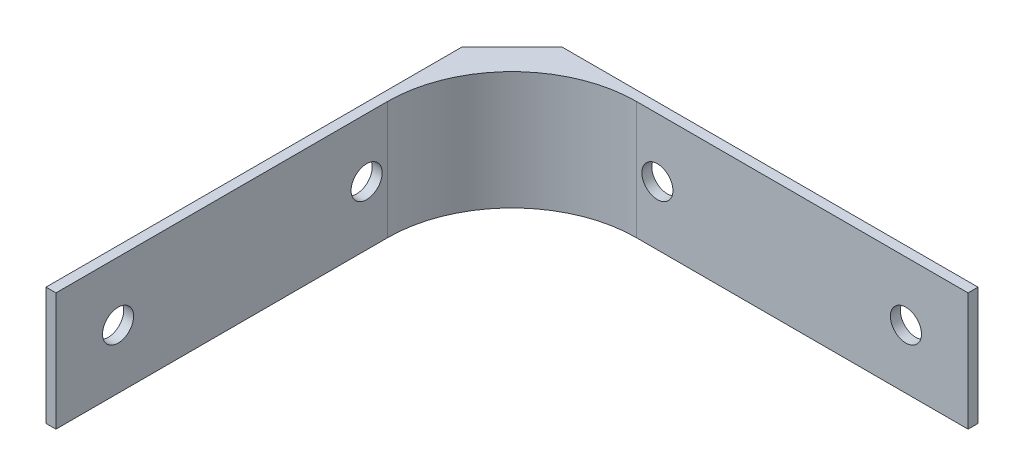
ISO-10303-21;
HEADER;
FILE_DESCRIPTION(('STEP AP214'),'2;1');
FILE_NAME('part.step','',(''),(''),'','','');
FILE_SCHEMA(('AUTOMOTIVE_DESIGN { 1 0 10303 214 1 1 1 1 }'));
ENDSEC;
DATA;
#1=APPLICATION_CONTEXT('core data for automotive mechanical design processes');
#2=APPLICATION_PROTOCOL_DEFINITION('international standard','automotive_design',2000,#1);
#3=PRODUCT_CONTEXT('',#1,'mechanical');
#4=PRODUCT('Part','Part','',(#3));
#5=PRODUCT_RELATED_PRODUCT_CATEGORY('part','',(#4));
#6=PRODUCT_DEFINITION_FORMATION('','',#4);
#7=PRODUCT_DEFINITION_CONTEXT('part definition',#1,'design');
#8=PRODUCT_DEFINITION('design','',#6,#7);
#9=PRODUCT_DEFINITION_SHAPE('','',#8);
#10=(LENGTH_UNIT() NAMED_UNIT(*) SI_UNIT(.MILLI.,.METRE.));
#11=(NAMED_UNIT(*) PLANE_ANGLE_UNIT() SI_UNIT($,.RADIAN.));
#12=(NAMED_UNIT(*) SI_UNIT($,.STERADIAN.) SOLID_ANGLE_UNIT());
#13=UNCERTAINTY_MEASURE_WITH_UNIT(LENGTH_MEASURE(1.E-05),#10,'distance_accuracy_value','');
#14=(GEOMETRIC_REPRESENTATION_CONTEXT(3) GLOBAL_UNCERTAINTY_ASSIGNED_CONTEXT((#13)) GLOBAL_UNIT_ASSIGNED_CONTEXT((#10,
#11,#12)) REPRESENTATION_CONTEXT('',''));
#15=CARTESIAN_POINT('',(0.,0.,0.));
#16=DIRECTION('',(0.,0.,1.));
#17=DIRECTION('',(1.,0.,0.));
#18=AXIS2_PLACEMENT_3D('',#15,#16,#17);
#19=CARTESIAN_POINT('',(21.6,19.,21.6));
#20=DIRECTION('',(0.,-1.,0.));
#21=DIRECTION('',(0.,0.,-1.));
#22=AXIS2_PLACEMENT_3D('',#19,#20,#21);
#23=CYLINDRICAL_SURFACE('',#22,20.);
#24=CARTESIAN_POINT('',(21.6,0.,21.6));
#25=DIRECTION('',(0.,1.,0.));
#26=DIRECTION('',(0.,0.,1.));
#27=AXIS2_PLACEMENT_3D('',#24,#25,#26);
#28=CIRCLE('',#27,20.);
#29=CARTESIAN_POINT('',(21.6,0.,1.6));
#30=VERTEX_POINT('',#29);
#31=CARTESIAN_POINT('',(1.6,0.,21.6));
#32=VERTEX_POINT('',#31);
#33=EDGE_CURVE('E134',#30,#32,#28,.T.);
#34=ORIENTED_EDGE('',*,*,#33,.F.);
#35=DIRECTION('',(0.,-1.,0.));
#36=VECTOR('',#35,1.);
#37=CARTESIAN_POINT('',(21.6,19.,1.6));
#38=LINE('',#37,#36);
#39=CARTESIAN_POINT('',(21.6,19.,1.6));
#40=VERTEX_POINT('',#39);
#41=EDGE_CURVE('E11',#40,#30,#38,.T.);
#42=ORIENTED_EDGE('',*,*,#41,.F.);
#43=CARTESIAN_POINT('',(21.6,19.,21.6));
#44=DIRECTION('',(0.,1.,0.));
#45=DIRECTION('',(0.,0.,1.));
#46=AXIS2_PLACEMENT_3D('',#43,#44,#45);
#47=CIRCLE('',#46,20.);
#48=CARTESIAN_POINT('',(1.6,19.,21.6));
#49=VERTEX_POINT('',#48);
#50=EDGE_CURVE('E154',#40,#49,#47,.T.);
#51=ORIENTED_EDGE('',*,*,#50,.T.);
#52=DIRECTION('',(0.,-1.,0.));
#53=VECTOR('',#52,1.);
#54=CARTESIAN_POINT('',(1.6,19.,21.6));
#55=LINE('',#54,#53);
#56=EDGE_CURVE('E55',#49,#32,#55,.T.);
#57=ORIENTED_EDGE('',*,*,#56,.T.);
#58=EDGE_LOOP('',(#34,#42,#51,#57));
#59=FACE_BOUND('',#58,.T.);
#60=ADVANCED_FACE('F39',(#59),#23,.F.);
#61=CARTESIAN_POINT('',(0.,19.,1.6));
#62=DIRECTION('',(0.,0.,-1.));
#63=DIRECTION('',(-1.,0.,0.));
#64=AXIS2_PLACEMENT_3D('',#61,#62,#63);
#65=PLANE('',#64);
#66=CARTESIAN_POINT('',(25.,9.5,1.6));
#67=DIRECTION('',(0.,0.,1.));
#68=DIRECTION('',(1.,0.,0.));
#69=AXIS2_PLACEMENT_3D('',#66,#67,#68);
#70=CIRCLE('',#69,2.5);
#71=CARTESIAN_POINT('',(27.5,9.5,1.6));
#72=VERTEX_POINT('',#71);
#73=EDGE_CURVE('E192',#72,#72,#70,.T.);
#74=ORIENTED_EDGE('',*,*,#73,.F.);
#75=EDGE_LOOP('',(#74));
#76=FACE_BOUND('',#75,.T.);
#77=CARTESIAN_POINT('',(65.,9.5,1.6));
#78=DIRECTION('',(0.,0.,1.));
#79=DIRECTION('',(1.,0.,0.));
#80=AXIS2_PLACEMENT_3D('',#77,#78,#79);
#81=CIRCLE('',#80,2.5);
#82=CARTESIAN_POINT('',(67.5,9.5,1.6));
#83=VERTEX_POINT('',#82);
#84=EDGE_CURVE('E185',#83,#83,#81,.T.);
#85=ORIENTED_EDGE('',*,*,#84,.F.);
#86=EDGE_LOOP('',(#85));
#87=FACE_BOUND('',#86,.T.);
#88=DIRECTION('',(1.,0.,0.));
#89=VECTOR('',#88,1.);
#90=CARTESIAN_POINT('',(0.,0.,1.6));
#91=LINE('',#90,#89);
#92=CARTESIAN_POINT('',(75.,0.,1.6));
#93=VERTEX_POINT('',#92);
#94=EDGE_CURVE('E136',#30,#93,#91,.T.);
#95=ORIENTED_EDGE('',*,*,#94,.T.);
#96=DIRECTION('',(0.,-1.,0.));
#97=VECTOR('',#96,1.);
#98=CARTESIAN_POINT('',(75.,19.,1.6));
#99=LINE('',#98,#97);
#100=CARTESIAN_POINT('',(75.,19.,1.6));
#101=VERTEX_POINT('',#100);
#102=EDGE_CURVE('E47',#101,#93,#99,.T.);
#103=ORIENTED_EDGE('',*,*,#102,.F.);
#104=DIRECTION('',(1.,0.,0.));
#105=VECTOR('',#104,1.);
#106=CARTESIAN_POINT('',(0.,19.,1.6));
#107=LINE('',#106,#105);
#108=EDGE_CURVE('E179',#40,#101,#107,.T.);
#109=ORIENTED_EDGE('',*,*,#108,.F.);
#110=ORIENTED_EDGE('',*,*,#41,.T.);
#111=EDGE_LOOP('',(#95,#103,#109,#110));
#112=FACE_BOUND('',#111,.T.);
#113=ADVANCED_FACE('F170',(#76,#87,#112),#65,.F.);
#114=CARTESIAN_POINT('',(75.,19.,0.));
#115=DIRECTION('',(1.,0.,0.));
#116=DIRECTION('',(0.,0.,-1.));
#117=AXIS2_PLACEMENT_3D('',#114,#115,#116);
#118=PLANE('',#117);
#119=DIRECTION('',(0.,0.,1.));
#120=VECTOR('',#119,1.);
#121=CARTESIAN_POINT('',(75.,0.,0.));
#122=LINE('',#121,#120);
#123=CARTESIAN_POINT('',(75.,0.,0.));
#124=VERTEX_POINT('',#123);
#125=EDGE_CURVE('E140',#124,#93,#122,.T.);
#126=ORIENTED_EDGE('',*,*,#125,.F.);
#127=DIRECTION('',(0.,-1.,0.));
#128=VECTOR('',#127,1.);
#129=CARTESIAN_POINT('',(75.,19.,0.));
#130=LINE('',#129,#128);
#131=CARTESIAN_POINT('',(75.,19.,0.));
#132=VERTEX_POINT('',#131);
#133=EDGE_CURVE('E160',#132,#124,#130,.T.);
#134=ORIENTED_EDGE('',*,*,#133,.F.);
#135=DIRECTION('',(0.,0.,1.));
#136=VECTOR('',#135,1.);
#137=CARTESIAN_POINT('',(75.,19.,0.));
#138=LINE('',#137,#136);
#139=EDGE_CURVE('E167',#132,#101,#138,.T.);
#140=ORIENTED_EDGE('',*,*,#139,.T.);
#141=ORIENTED_EDGE('',*,*,#102,.T.);
#142=EDGE_LOOP('',(#126,#134,#140,#141));
#143=FACE_BOUND('',#142,.T.);
#144=ADVANCED_FACE('F165',(#143),#118,.T.);
#145=CARTESIAN_POINT('',(0.,19.,0.));
#146=DIRECTION('',(0.,0.,-1.));
#147=DIRECTION('',(-1.,0.,0.));
#148=AXIS2_PLACEMENT_3D('',#145,#146,#147);
#149=PLANE('',#148);
#150=CARTESIAN_POINT('',(25.,9.5,0.));
#151=DIRECTION('',(0.,0.,1.));
#152=DIRECTION('',(1.,0.,0.));
#153=AXIS2_PLACEMENT_3D('',#150,#151,#152);
#154=CIRCLE('',#153,2.5);
#155=CARTESIAN_POINT('',(27.5,9.5,0.));
#156=VERTEX_POINT('',#155);
#157=EDGE_CURVE('E137',#156,#156,#154,.T.);
#158=ORIENTED_EDGE('',*,*,#157,.T.);
#159=EDGE_LOOP('',(#158));
#160=FACE_BOUND('',#159,.T.);
#161=CARTESIAN_POINT('',(65.,9.5,0.));
#162=DIRECTION('',(0.,0.,1.));
#163=DIRECTION('',(1.,0.,0.));
#164=AXIS2_PLACEMENT_3D('',#161,#162,#163);
#165=CIRCLE('',#164,2.5);
#166=CARTESIAN_POINT('',(67.5,9.5,0.));
#167=VERTEX_POINT('',#166);
#168=EDGE_CURVE('E188',#167,#167,#165,.T.);
#169=ORIENTED_EDGE('',*,*,#168,.T.);
#170=EDGE_LOOP('',(#169));
#171=FACE_BOUND('',#170,.T.);
#172=DIRECTION('',(1.,0.,0.));
#173=VECTOR('',#172,1.);
#174=CARTESIAN_POINT('',(0.,0.,0.));
#175=LINE('',#174,#173);
#176=CARTESIAN_POINT('',(7.99999999999999,0.,0.));
#177=VERTEX_POINT('',#176);
#178=EDGE_CURVE('E143',#177,#124,#175,.T.);
#179=ORIENTED_EDGE('',*,*,#178,.F.);
#180=DIRECTION('',(0.,-1.,0.));
#181=VECTOR('',#180,1.);
#182=CARTESIAN_POINT('',(7.99999999999999,19.,0.));
#183=LINE('',#182,#181);
#184=CARTESIAN_POINT('',(7.99999999999999,19.,0.));
#185=VERTEX_POINT('',#184);
#186=EDGE_CURVE('E158',#185,#177,#183,.T.);
#187=ORIENTED_EDGE('',*,*,#186,.F.);
#188=DIRECTION('',(1.,0.,0.));
#189=VECTOR('',#188,1.);
#190=CARTESIAN_POINT('',(0.,19.,0.));
#191=LINE('',#190,#189);
#192=EDGE_CURVE('E178',#185,#132,#191,.T.);
#193=ORIENTED_EDGE('',*,*,#192,.T.);
#194=ORIENTED_EDGE('',*,*,#133,.T.);
#195=EDGE_LOOP('',(#179,#187,#193,#194));
#196=FACE_BOUND('',#195,.T.);
#197=ADVANCED_FACE('F176',(#160,#171,#196),#149,.T.);
#198=CARTESIAN_POINT('',(4.,19.,4.));
#199=DIRECTION('',(0.707106781186548,0.,0.707106781186548));
#200=DIRECTION('',(0.707106781186548,0.,-0.707106781186548));
#201=AXIS2_PLACEMENT_3D('',#198,#199,#200);
#202=PLANE('',#201);
#203=DIRECTION('',(-0.707106781186547,0.,0.707106781186548));
#204=VECTOR('',#203,1.);
#205=CARTESIAN_POINT('',(4.,0.,4.));
#206=LINE('',#205,#204);
#207=CARTESIAN_POINT('',(0.,0.,7.99999999999999));
#208=VERTEX_POINT('',#207);
#209=EDGE_CURVE('E146',#177,#208,#206,.T.);
#210=ORIENTED_EDGE('',*,*,#209,.T.);
#211=DIRECTION('',(0.,-1.,0.));
#212=VECTOR('',#211,1.);
#213=CARTESIAN_POINT('',(0.,19.,7.99999999999999));
#214=LINE('',#213,#212);
#215=CARTESIAN_POINT('',(0.,19.,7.99999999999999));
#216=VERTEX_POINT('',#215);
#217=EDGE_CURVE('E126',#216,#208,#214,.T.);
#218=ORIENTED_EDGE('',*,*,#217,.F.);
#219=DIRECTION('',(-0.707106781186547,0.,0.707106781186548));
#220=VECTOR('',#219,1.);
#221=CARTESIAN_POINT('',(4.,19.,4.));
#222=LINE('',#221,#220);
#223=EDGE_CURVE('E114',#185,#216,#222,.T.);
#224=ORIENTED_EDGE('',*,*,#223,.F.);
#225=ORIENTED_EDGE('',*,*,#186,.T.);
#226=EDGE_LOOP('',(#210,#218,#224,#225));
#227=FACE_BOUND('',#226,.T.);
#228=ADVANCED_FACE('F237',(#227),#202,.F.);
#229=CARTESIAN_POINT('',(0.,19.,0.));
#230=DIRECTION('',(1.,0.,0.));
#231=DIRECTION('',(0.,0.,-1.));
#232=AXIS2_PLACEMENT_3D('',#229,#230,#231);
#233=PLANE('',#232);
#234=CARTESIAN_POINT('',(0.,9.5,65.));
#235=DIRECTION('',(1.,0.,0.));
#236=DIRECTION('',(0.,0.,-1.));
#237=AXIS2_PLACEMENT_3D('',#234,#235,#236);
#238=CIRCLE('',#237,2.49999999999999);
#239=CARTESIAN_POINT('',(0.,9.5,62.5));
#240=VERTEX_POINT('',#239);
#241=EDGE_CURVE('E189',#240,#240,#238,.T.);
#242=ORIENTED_EDGE('',*,*,#241,.T.);
#243=EDGE_LOOP('',(#242));
#244=FACE_BOUND('',#243,.T.);
#245=CARTESIAN_POINT('',(0.,9.5,25.));
#246=DIRECTION('',(1.,0.,0.));
#247=DIRECTION('',(0.,0.,-1.));
#248=AXIS2_PLACEMENT_3D('',#245,#246,#247);
#249=CIRCLE('',#248,2.5);
#250=CARTESIAN_POINT('',(0.,9.5,22.5));
#251=VERTEX_POINT('',#250);
#252=EDGE_CURVE('E200',#251,#251,#249,.T.);
#253=ORIENTED_EDGE('',*,*,#252,.T.);
#254=EDGE_LOOP('',(#253));
#255=FACE_BOUND('',#254,.T.);
#256=DIRECTION('',(0.,0.,1.));
#257=VECTOR('',#256,1.);
#258=CARTESIAN_POINT('',(0.,0.,0.));
#259=LINE('',#258,#257);
#260=CARTESIAN_POINT('',(0.,0.,75.));
#261=VERTEX_POINT('',#260);
#262=EDGE_CURVE('E123',#208,#261,#259,.T.);
#263=ORIENTED_EDGE('',*,*,#262,.T.);
#264=DIRECTION('',(0.,-1.,0.));
#265=VECTOR('',#264,1.);
#266=CARTESIAN_POINT('',(0.,19.,75.));
#267=LINE('',#266,#265);
#268=CARTESIAN_POINT('',(0.,19.,75.));
#269=VERTEX_POINT('',#268);
#270=EDGE_CURVE('E120',#269,#261,#267,.T.);
#271=ORIENTED_EDGE('',*,*,#270,.F.);
#272=DIRECTION('',(0.,0.,1.));
#273=VECTOR('',#272,1.);
#274=CARTESIAN_POINT('',(0.,19.,0.));
#275=LINE('',#274,#273);
#276=EDGE_CURVE('E105',#216,#269,#275,.T.);
#277=ORIENTED_EDGE('',*,*,#276,.F.);
#278=ORIENTED_EDGE('',*,*,#217,.T.);
#279=EDGE_LOOP('',(#263,#271,#277,#278));
#280=FACE_BOUND('',#279,.T.);
#281=ADVANCED_FACE('F121',(#244,#255,#280),#233,.F.);
#282=CARTESIAN_POINT('',(-6.50521303491303E-13,19.,75.));
#283=DIRECTION('',(0.,0.,-1.));
#284=DIRECTION('',(-1.,0.,0.));
#285=AXIS2_PLACEMENT_3D('',#282,#283,#284);
#286=PLANE('',#285);
#287=DIRECTION('',(1.,0.,0.));
#288=VECTOR('',#287,1.);
#289=CARTESIAN_POINT('',(-6.50521303491303E-13,0.,75.));
#290=LINE('',#289,#288);
#291=CARTESIAN_POINT('',(1.60000000000001,0.,75.));
#292=VERTEX_POINT('',#291);
#293=EDGE_CURVE('E149',#261,#292,#290,.T.);
#294=ORIENTED_EDGE('',*,*,#293,.T.);
#295=DIRECTION('',(0.,-1.,0.));
#296=VECTOR('',#295,1.);
#297=CARTESIAN_POINT('',(1.60000000000001,19.,75.));
#298=LINE('',#297,#296);
#299=CARTESIAN_POINT('',(1.60000000000001,19.,75.));
#300=VERTEX_POINT('',#299);
#301=EDGE_CURVE('E81',#300,#292,#298,.T.);
#302=ORIENTED_EDGE('',*,*,#301,.F.);
#303=DIRECTION('',(1.,0.,0.));
#304=VECTOR('',#303,1.);
#305=CARTESIAN_POINT('',(-6.50521303491303E-13,19.,75.));
#306=LINE('',#305,#304);
#307=EDGE_CURVE('E111',#269,#300,#306,.T.);
#308=ORIENTED_EDGE('',*,*,#307,.F.);
#309=ORIENTED_EDGE('',*,*,#270,.T.);
#310=EDGE_LOOP('',(#294,#302,#308,#309));
#311=FACE_BOUND('',#310,.T.);
#312=ADVANCED_FACE('F128',(#311),#286,.F.);
#313=CARTESIAN_POINT('',(1.6,19.,0.));
#314=DIRECTION('',(1.,0.,0.));
#315=DIRECTION('',(0.,0.,-1.));
#316=AXIS2_PLACEMENT_3D('',#313,#314,#315);
#317=PLANE('',#316);
#318=CARTESIAN_POINT('',(1.60000000000001,9.5,65.));
#319=DIRECTION('',(1.,0.,0.));
#320=DIRECTION('',(0.,0.,-1.));
#321=AXIS2_PLACEMENT_3D('',#318,#319,#320);
#322=CIRCLE('',#321,2.49999999999999);
#323=CARTESIAN_POINT('',(1.60000000000001,9.5,62.5));
#324=VERTEX_POINT('',#323);
#325=EDGE_CURVE('E203',#324,#324,#322,.T.);
#326=ORIENTED_EDGE('',*,*,#325,.F.);
#327=EDGE_LOOP('',(#326));
#328=FACE_BOUND('',#327,.T.);
#329=CARTESIAN_POINT('',(1.6,9.5,25.));
#330=DIRECTION('',(1.,0.,0.));
#331=DIRECTION('',(0.,0.,-1.));
#332=AXIS2_PLACEMENT_3D('',#329,#330,#331);
#333=CIRCLE('',#332,2.5);
#334=CARTESIAN_POINT('',(1.6,9.5,22.5));
#335=VERTEX_POINT('',#334);
#336=EDGE_CURVE('E197',#335,#335,#333,.T.);
#337=ORIENTED_EDGE('',*,*,#336,.F.);
#338=EDGE_LOOP('',(#337));
#339=FACE_BOUND('',#338,.T.);
#340=DIRECTION('',(0.,0.,1.));
#341=VECTOR('',#340,1.);
#342=CARTESIAN_POINT('',(1.6,0.,0.));
#343=LINE('',#342,#341);
#344=EDGE_CURVE('E151',#32,#292,#343,.T.);
#345=ORIENTED_EDGE('',*,*,#344,.F.);
#346=ORIENTED_EDGE('',*,*,#56,.F.);
#347=DIRECTION('',(0.,0.,1.));
#348=VECTOR('',#347,1.);
#349=CARTESIAN_POINT('',(1.6,19.,0.));
#350=LINE('',#349,#348);
#351=EDGE_CURVE('E129',#49,#300,#350,.T.);
#352=ORIENTED_EDGE('',*,*,#351,.T.);
#353=ORIENTED_EDGE('',*,*,#301,.T.);
#354=EDGE_LOOP('',(#345,#346,#352,#353));
#355=FACE_BOUND('',#354,.T.);
#356=ADVANCED_FACE('F218',(#328,#339,#355),#317,.T.);
#357=CARTESIAN_POINT('',(0.,19.,0.));
#358=DIRECTION('',(0.,1.,0.));
#359=DIRECTION('',(0.,0.,1.));
#360=AXIS2_PLACEMENT_3D('',#357,#358,#359);
#361=PLANE('',#360);
#362=ORIENTED_EDGE('',*,*,#50,.F.);
#363=ORIENTED_EDGE('',*,*,#108,.T.);
#364=ORIENTED_EDGE('',*,*,#139,.F.);
#365=ORIENTED_EDGE('',*,*,#192,.F.);
#366=ORIENTED_EDGE('',*,*,#223,.T.);
#367=ORIENTED_EDGE('',*,*,#276,.T.);
#368=ORIENTED_EDGE('',*,*,#307,.T.);
#369=ORIENTED_EDGE('',*,*,#351,.F.);
#370=EDGE_LOOP('',(#362,#363,#364,#365,#366,#367,#368,#369));
#371=FACE_BOUND('',#370,.T.);
#372=ADVANCED_FACE('F108',(#371),#361,.T.);
#373=CARTESIAN_POINT('',(0.,0.,0.));
#374=DIRECTION('',(0.,1.,0.));
#375=DIRECTION('',(0.,0.,1.));
#376=AXIS2_PLACEMENT_3D('',#373,#374,#375);
#377=PLANE('',#376);
#378=ORIENTED_EDGE('',*,*,#33,.T.);
#379=ORIENTED_EDGE('',*,*,#344,.T.);
#380=ORIENTED_EDGE('',*,*,#293,.F.);
#381=ORIENTED_EDGE('',*,*,#262,.F.);
#382=ORIENTED_EDGE('',*,*,#209,.F.);
#383=ORIENTED_EDGE('',*,*,#178,.T.);
#384=ORIENTED_EDGE('',*,*,#125,.T.);
#385=ORIENTED_EDGE('',*,*,#94,.F.);
#386=EDGE_LOOP('',(#378,#379,#380,#381,#382,#383,#384,#385));
#387=FACE_BOUND('',#386,.T.);
#388=ADVANCED_FACE('F172',(#387),#377,.F.);
#389=CARTESIAN_POINT('',(65.,9.5,0.));
#390=DIRECTION('',(0.,0.,1.));
#391=DIRECTION('',(1.,0.,0.));
#392=AXIS2_PLACEMENT_3D('',#389,#390,#391);
#393=CYLINDRICAL_SURFACE('',#392,2.5);
#394=ORIENTED_EDGE('',*,*,#168,.F.);
#395=EDGE_LOOP('',(#394));
#396=FACE_BOUND('',#395,.T.);
#397=ORIENTED_EDGE('',*,*,#84,.T.);
#398=EDGE_LOOP('',(#397));
#399=FACE_BOUND('',#398,.T.);
#400=ADVANCED_FACE('F248',(#396,#399),#393,.F.);
#401=CARTESIAN_POINT('',(25.,9.5,0.));
#402=DIRECTION('',(0.,0.,1.));
#403=DIRECTION('',(1.,0.,0.));
#404=AXIS2_PLACEMENT_3D('',#401,#402,#403);
#405=CYLINDRICAL_SURFACE('',#404,2.5);
#406=ORIENTED_EDGE('',*,*,#157,.F.);
#407=EDGE_LOOP('',(#406));
#408=FACE_BOUND('',#407,.T.);
#409=ORIENTED_EDGE('',*,*,#73,.T.);
#410=EDGE_LOOP('',(#409));
#411=FACE_BOUND('',#410,.T.);
#412=ADVANCED_FACE('F253',(#408,#411),#405,.F.);
#413=CARTESIAN_POINT('',(0.,9.5,25.));
#414=DIRECTION('',(1.,0.,0.));
#415=DIRECTION('',(0.,0.,-1.));
#416=AXIS2_PLACEMENT_3D('',#413,#414,#415);
#417=CYLINDRICAL_SURFACE('',#416,2.5);
#418=CARTESIAN_POINT('',(0.,9.5,22.5));
#419=CARTESIAN_POINT('',(0.0166666666666619,9.5,22.5));
#420=CARTESIAN_POINT('',(0.0333333333333286,9.5,22.5));
#421=CARTESIAN_POINT('',(0.0666666666666621,9.5,22.5));
#422=CARTESIAN_POINT('',(0.0833333333333289,9.5,22.5));
#423=CARTESIAN_POINT('',(0.116666666666662,9.5,22.5));
#424=CARTESIAN_POINT('',(0.133333333333329,9.5,22.5));
#425=CARTESIAN_POINT('',(0.166666666666663,9.5,22.5));
#426=CARTESIAN_POINT('',(0.183333333333329,9.5,22.5));
#427=CARTESIAN_POINT('',(0.216666666666663,9.5,22.5));
#428=CARTESIAN_POINT('',(0.23333333333333,9.5,22.5));
#429=CARTESIAN_POINT('',(0.266666666666663,9.5,22.5));
#430=CARTESIAN_POINT('',(0.28333333333333,9.5,22.5));
#431=CARTESIAN_POINT('',(0.316666666666663,9.5,22.5));
#432=CARTESIAN_POINT('',(0.33333333333333,9.5,22.5));
#433=CARTESIAN_POINT('',(0.366666666666663,9.5,22.5));
#434=CARTESIAN_POINT('',(0.38333333333333,9.5,22.5));
#435=CARTESIAN_POINT('',(0.416666666666664,9.5,22.5));
#436=CARTESIAN_POINT('',(0.433333333333331,9.5,22.5));
#437=CARTESIAN_POINT('',(0.466666666666664,9.5,22.5));
#438=CARTESIAN_POINT('',(0.483333333333331,9.5,22.5));
#439=CARTESIAN_POINT('',(0.516666666666664,9.5,22.5));
#440=CARTESIAN_POINT('',(0.533333333333331,9.5,22.5));
#441=CARTESIAN_POINT('',(0.566666666666664,9.5,22.5));
#442=CARTESIAN_POINT('',(0.583333333333331,9.5,22.5));
#443=CARTESIAN_POINT('',(0.616666666666665,9.5,22.5));
#444=CARTESIAN_POINT('',(0.633333333333331,9.5,22.5));
#445=CARTESIAN_POINT('',(0.666666666666665,9.5,22.5));
#446=CARTESIAN_POINT('',(0.683333333333332,9.5,22.5));
#447=CARTESIAN_POINT('',(0.716666666666665,9.5,22.5));
#448=CARTESIAN_POINT('',(0.733333333333332,9.5,22.5));
#449=CARTESIAN_POINT('',(0.766666666666665,9.5,22.5));
#450=CARTESIAN_POINT('',(0.783333333333332,9.5,22.5));
#451=CARTESIAN_POINT('',(0.816666666666666,9.5,22.5));
#452=CARTESIAN_POINT('',(0.833333333333332,9.5,22.5));
#453=CARTESIAN_POINT('',(0.866666666666666,9.5,22.5));
#454=CARTESIAN_POINT('',(0.883333333333333,9.5,22.5));
#455=CARTESIAN_POINT('',(0.916666666666666,9.5,22.5));
#456=CARTESIAN_POINT('',(0.933333333333333,9.5,22.5));
#457=CARTESIAN_POINT('',(0.966666666666666,9.5,22.5));
#458=CARTESIAN_POINT('',(0.983333333333333,9.5,22.5));
#459=CARTESIAN_POINT('',(1.01666666666667,9.5,22.5));
#460=CARTESIAN_POINT('',(1.03333333333333,9.5,22.5));
#461=CARTESIAN_POINT('',(1.06666666666667,9.5,22.5));
#462=CARTESIAN_POINT('',(1.08333333333333,9.5,22.5));
#463=CARTESIAN_POINT('',(1.11666666666667,9.5,22.5));
#464=CARTESIAN_POINT('',(1.13333333333333,9.5,22.5));
#465=CARTESIAN_POINT('',(1.16666666666667,9.5,22.5));
#466=CARTESIAN_POINT('',(1.18333333333333,9.5,22.5));
#467=CARTESIAN_POINT('',(1.21666666666667,9.5,22.5));
#468=CARTESIAN_POINT('',(1.23333333333333,9.5,22.5));
#469=CARTESIAN_POINT('',(1.26666666666667,9.5,22.5));
#470=CARTESIAN_POINT('',(1.28333333333333,9.5,22.5));
#471=CARTESIAN_POINT('',(1.31666666666667,9.5,22.5));
#472=CARTESIAN_POINT('',(1.33333333333333,9.5,22.5));
#473=CARTESIAN_POINT('',(1.36666666666667,9.5,22.5));
#474=CARTESIAN_POINT('',(1.38333333333333,9.5,22.5));
#475=CARTESIAN_POINT('',(1.41666666666667,9.5,22.5));
#476=CARTESIAN_POINT('',(1.43333333333334,9.5,22.5));
#477=CARTESIAN_POINT('',(1.46666666666667,9.5,22.5));
#478=CARTESIAN_POINT('',(1.48333333333334,9.5,22.5));
#479=CARTESIAN_POINT('',(1.51666666666667,9.5,22.5));
#480=CARTESIAN_POINT('',(1.53333333333334,9.5,22.5));
#481=CARTESIAN_POINT('',(1.56666666666667,9.5,22.5));
#482=CARTESIAN_POINT('',(1.58333333333334,9.5,22.5));
#483=CARTESIAN_POINT('',(1.6,9.5,22.5));
#484=B_SPLINE_CURVE_WITH_KNOTS('',3,(#418,#419,#420,#421,#422,#423,#424,#425,#426,#427,#428,
#429,#430,#431,#432,#433,#434,#435,#436,#437,#438,#439,#440,#441,#442,#443,#444,#445,#446,#447,
#448,#449,#450,#451,#452,#453,#454,#455,#456,#457,#458,#459,#460,#461,#462,#463,#464,#465,#466,
#467,#468,#469,#470,#471,#472,#473,#474,#475,#476,#477,#478,#479,#480,#481,#482,#483),
.UNSPECIFIED.,.F.,.F.,(4,2,2,2,2,2,2,2,2,2,2,2,2,2,2,2,2,2,2,2,2,2,2,2,2,2,2,2,2,2,2,2,4),(0.,
0.0500000000000002,0.1,0.150000000000001,0.200000000000001,0.250000000000001,0.300000000000001,
0.350000000000002,0.400000000000002,0.450000000000002,0.500000000000002,0.550000000000002,
0.600000000000003,0.650000000000003,0.700000000000003,0.750000000000003,0.800000000000004,
0.850000000000004,0.900000000000004,0.950000000000004,1.,1.05,1.1,1.15000000000001,
1.20000000000001,1.25000000000001,1.30000000000001,1.35000000000001,1.40000000000001,
1.45000000000001,1.50000000000001,1.55000000000001,1.60000000000001),.UNSPECIFIED.);
#485=EDGE_CURVE('BSEAM214',#251,#335,#484,.T.);
#486=ORIENTED_EDGE('',*,*,#252,.F.);
#487=ORIENTED_EDGE('',*,*,#336,.T.);
#488=ORIENTED_EDGE('',*,*,#485,.T.);
#489=ORIENTED_EDGE('',*,*,#485,.F.);
#490=EDGE_LOOP('',(#486,#488,#487,#489));
#491=FACE_BOUND('',#490,.T.);
#492=ADVANCED_FACE('F214',(#491),#417,.F.);
#493=CARTESIAN_POINT('',(0.,9.5,65.));
#494=DIRECTION('',(1.,0.,0.));
#495=DIRECTION('',(0.,0.,-1.));
#496=AXIS2_PLACEMENT_3D('',#493,#494,#495);
#497=CYLINDRICAL_SURFACE('',#496,2.49999999999999);
#498=CARTESIAN_POINT('',(0.,9.5,62.5));
#499=CARTESIAN_POINT('',(0.0166666666666669,9.5,62.5));
#500=CARTESIAN_POINT('',(0.0333333333333336,9.5,62.5));
#501=CARTESIAN_POINT('',(0.0666666666666671,9.5,62.5));
#502=CARTESIAN_POINT('',(0.0833333333333338,9.5,62.5));
#503=CARTESIAN_POINT('',(0.116666666666667,9.5,62.5));
#504=CARTESIAN_POINT('',(0.133333333333334,9.5,62.5));
#505=CARTESIAN_POINT('',(0.166666666666668,9.5,62.5));
#506=CARTESIAN_POINT('',(0.183333333333334,9.5,62.5));
#507=CARTESIAN_POINT('',(0.216666666666668,9.5,62.5));
#508=CARTESIAN_POINT('',(0.233333333333335,9.5,62.5));
#509=CARTESIAN_POINT('',(0.266666666666668,9.5,62.5));
#510=CARTESIAN_POINT('',(0.283333333333335,9.5,62.5));
#511=CARTESIAN_POINT('',(0.316666666666668,9.5,62.5));
#512=CARTESIAN_POINT('',(0.333333333333335,9.5,62.5));
#513=CARTESIAN_POINT('',(0.366666666666668,9.5,62.5));
#514=CARTESIAN_POINT('',(0.383333333333335,9.5,62.5));
#515=CARTESIAN_POINT('',(0.416666666666669,9.5,62.5));
#516=CARTESIAN_POINT('',(0.433333333333335,9.5,62.5));
#517=CARTESIAN_POINT('',(0.466666666666669,9.5,62.5));
#518=CARTESIAN_POINT('',(0.483333333333336,9.5,62.5));
#519=CARTESIAN_POINT('',(0.516666666666669,9.5,62.5));
#520=CARTESIAN_POINT('',(0.533333333333336,9.5,62.5));
#521=CARTESIAN_POINT('',(0.566666666666669,9.5,62.5));
#522=CARTESIAN_POINT('',(0.583333333333336,9.5,62.5));
#523=CARTESIAN_POINT('',(0.61666666666667,9.5,62.5));
#524=CARTESIAN_POINT('',(0.633333333333336,9.5,62.5));
#525=CARTESIAN_POINT('',(0.66666666666667,9.5,62.5));
#526=CARTESIAN_POINT('',(0.683333333333337,9.5,62.5));
#527=CARTESIAN_POINT('',(0.71666666666667,9.5,62.5));
#528=CARTESIAN_POINT('',(0.733333333333337,9.5,62.5));
#529=CARTESIAN_POINT('',(0.76666666666667,9.5,62.5));
#530=CARTESIAN_POINT('',(0.783333333333337,9.5,62.5));
#531=CARTESIAN_POINT('',(0.816666666666671,9.5,62.5));
#532=CARTESIAN_POINT('',(0.833333333333337,9.5,62.5));
#533=CARTESIAN_POINT('',(0.866666666666671,9.5,62.5));
#534=CARTESIAN_POINT('',(0.883333333333338,9.5,62.5));
#535=CARTESIAN_POINT('',(0.916666666666671,9.5,62.5));
#536=CARTESIAN_POINT('',(0.933333333333338,9.5,62.5));
#537=CARTESIAN_POINT('',(0.966666666666671,9.5,62.5));
#538=CARTESIAN_POINT('',(0.983333333333338,9.5,62.5));
#539=CARTESIAN_POINT('',(1.01666666666667,9.5,62.5));
#540=CARTESIAN_POINT('',(1.03333333333334,9.5,62.5));
#541=CARTESIAN_POINT('',(1.06666666666667,9.5,62.5));
#542=CARTESIAN_POINT('',(1.08333333333334,9.5,62.5));
#543=CARTESIAN_POINT('',(1.11666666666667,9.5,62.5));
#544=CARTESIAN_POINT('',(1.13333333333334,9.5,62.5));
#545=CARTESIAN_POINT('',(1.16666666666667,9.5,62.5));
#546=CARTESIAN_POINT('',(1.18333333333334,9.5,62.5));
#547=CARTESIAN_POINT('',(1.21666666666667,9.5,62.5));
#548=CARTESIAN_POINT('',(1.23333333333334,9.5,62.5));
#549=CARTESIAN_POINT('',(1.26666666666667,9.5,62.5));
#550=CARTESIAN_POINT('',(1.28333333333334,9.5,62.5));
#551=CARTESIAN_POINT('',(1.31666666666667,9.5,62.5));
#552=CARTESIAN_POINT('',(1.33333333333334,9.5,62.5));
#553=CARTESIAN_POINT('',(1.36666666666667,9.5,62.5));
#554=CARTESIAN_POINT('',(1.38333333333334,9.5,62.5));
#555=CARTESIAN_POINT('',(1.41666666666667,9.5,62.5));
#556=CARTESIAN_POINT('',(1.43333333333334,9.5,62.5));
#557=CARTESIAN_POINT('',(1.46666666666667,9.5,62.5));
#558=CARTESIAN_POINT('',(1.48333333333334,9.5,62.5));
#559=CARTESIAN_POINT('',(1.51666666666667,9.5,62.5));
#560=CARTESIAN_POINT('',(1.53333333333334,9.5,62.5));
#561=CARTESIAN_POINT('',(1.56666666666667,9.5,62.5));
#562=CARTESIAN_POINT('',(1.58333333333334,9.5,62.5));
#563=CARTESIAN_POINT('',(1.60000000000001,9.5,62.5));
#564=B_SPLINE_CURVE_WITH_KNOTS('',3,(#498,#499,#500,#501,#502,#503,#504,#505,#506,#507,#508,
#509,#510,#511,#512,#513,#514,#515,#516,#517,#518,#519,#520,#521,#522,#523,#524,#525,#526,#527,
#528,#529,#530,#531,#532,#533,#534,#535,#536,#537,#538,#539,#540,#541,#542,#543,#544,#545,#546,
#547,#548,#549,#550,#551,#552,#553,#554,#555,#556,#557,#558,#559,#560,#561,#562,#563),
.UNSPECIFIED.,.F.,.F.,(4,2,2,2,2,2,2,2,2,2,2,2,2,2,2,2,2,2,2,2,2,2,2,2,2,2,2,2,2,2,2,2,4),(0.,
0.0500000000000002,0.1,0.150000000000001,0.200000000000001,0.250000000000001,0.300000000000001,
0.350000000000002,0.400000000000002,0.450000000000002,0.500000000000002,0.550000000000002,
0.600000000000003,0.650000000000003,0.700000000000003,0.750000000000003,0.800000000000004,
0.850000000000004,0.900000000000004,0.950000000000004,1.,1.05,1.1,1.15000000000001,
1.20000000000001,1.25000000000001,1.30000000000001,1.35000000000001,1.40000000000001,
1.45000000000001,1.50000000000001,1.55000000000001,1.60000000000001),.UNSPECIFIED.);
#565=EDGE_CURVE('BSEAM211',#240,#324,#564,.T.);
#566=ORIENTED_EDGE('',*,*,#241,.F.);
#567=ORIENTED_EDGE('',*,*,#325,.T.);
#568=ORIENTED_EDGE('',*,*,#565,.T.);
#569=ORIENTED_EDGE('',*,*,#565,.F.);
#570=EDGE_LOOP('',(#566,#568,#567,#569));
#571=FACE_BOUND('',#570,.T.);
#572=ADVANCED_FACE('F211',(#571),#497,.F.);
#573=CLOSED_SHELL('',(#60,#113,#144,#197,#228,#281,#312,#356,#372,#388,#400,#412,#492,#572));
#574=MANIFOLD_SOLID_BREP('B2',#573);
#575=ADVANCED_BREP_SHAPE_REPRESENTATION('',(#18,#574),#14);
#576=SHAPE_DEFINITION_REPRESENTATION(#9,#575);
ENDSEC;
END-ISO-10303-21;
